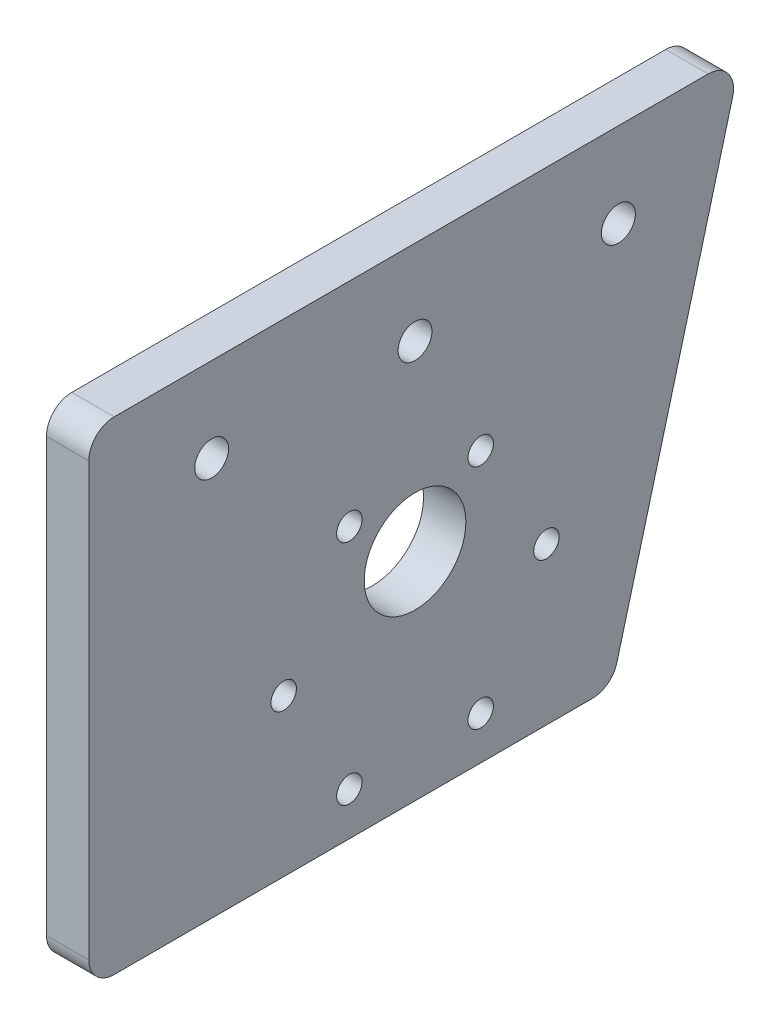
ISO-10303-21;
HEADER;
FILE_DESCRIPTION(('STEP AP214'),'2;1');
FILE_NAME('part.step','',(''),(''),'','','');
FILE_SCHEMA(('AUTOMOTIVE_DESIGN { 1 0 10303 214 1 1 1 1 }'));
ENDSEC;
DATA;
#1=APPLICATION_CONTEXT('core data for automotive mechanical design processes');
#2=APPLICATION_PROTOCOL_DEFINITION('international standard','automotive_design',2000,#1);
#3=PRODUCT_CONTEXT('',#1,'mechanical');
#4=PRODUCT('Part','Part','',(#3));
#5=PRODUCT_RELATED_PRODUCT_CATEGORY('part','',(#4));
#6=PRODUCT_DEFINITION_FORMATION('','',#4);
#7=PRODUCT_DEFINITION_CONTEXT('part definition',#1,'design');
#8=PRODUCT_DEFINITION('design','',#6,#7);
#9=PRODUCT_DEFINITION_SHAPE('','',#8);
#10=(LENGTH_UNIT() NAMED_UNIT(*) SI_UNIT(.MILLI.,.METRE.));
#11=(NAMED_UNIT(*) PLANE_ANGLE_UNIT() SI_UNIT($,.RADIAN.));
#12=(NAMED_UNIT(*) SI_UNIT($,.STERADIAN.) SOLID_ANGLE_UNIT());
#13=UNCERTAINTY_MEASURE_WITH_UNIT(LENGTH_MEASURE(1.E-05),#10,'distance_accuracy_value','');
#14=(GEOMETRIC_REPRESENTATION_CONTEXT(3) GLOBAL_UNCERTAINTY_ASSIGNED_CONTEXT((#13)) GLOBAL_UNIT_ASSIGNED_CONTEXT((#10,
#11,#12)) REPRESENTATION_CONTEXT('',''));
#15=CARTESIAN_POINT('',(0.,0.,0.));
#16=DIRECTION('',(0.,0.,1.));
#17=DIRECTION('',(1.,0.,0.));
#18=AXIS2_PLACEMENT_3D('',#15,#16,#17);
#19=CARTESIAN_POINT('',(5.,0.,0.));
#20=DIRECTION('',(-1.,0.,0.));
#21=DIRECTION('',(0.,0.,1.));
#22=AXIS2_PLACEMENT_3D('',#19,#20,#21);
#23=PLANE('',#22);
#24=DIRECTION('',(0.,0.,1.));
#25=VECTOR('',#24,1.);
#26=CARTESIAN_POINT('',(5.,0.,0.));
#27=LINE('',#26,#25);
#28=CARTESIAN_POINT('',(5.,0.,-73.0903238814764));
#29=VERTEX_POINT('',#28);
#30=CARTESIAN_POINT('',(5.,0.,-3.));
#31=VERTEX_POINT('',#30);
#32=EDGE_CURVE('E142',#29,#31,#27,.T.);
#33=ORIENTED_EDGE('',*,*,#32,.T.);
#34=CARTESIAN_POINT('',(5.,-3.,-3.));
#35=DIRECTION('',(-1.,0.,0.));
#36=DIRECTION('',(0.,0.,1.));
#37=AXIS2_PLACEMENT_3D('',#34,#35,#36);
#38=CIRCLE('',#37,3.);
#39=CARTESIAN_POINT('',(5.,-3.00000000000002,0.));
#40=VERTEX_POINT('',#39);
#41=EDGE_CURVE('E161',#31,#40,#38,.F.);
#42=ORIENTED_EDGE('',*,*,#41,.T.);
#43=DIRECTION('',(0.,-1.,0.));
#44=VECTOR('',#43,1.);
#45=CARTESIAN_POINT('',(5.,-57.,0.));
#46=LINE('',#45,#44);
#47=CARTESIAN_POINT('',(5.,-54.,0.));
#48=VERTEX_POINT('',#47);
#49=EDGE_CURVE('E125',#40,#48,#46,.T.);
#50=ORIENTED_EDGE('',*,*,#49,.T.);
#51=CARTESIAN_POINT('',(5.,-54.,-3.));
#52=DIRECTION('',(-1.,0.,0.));
#53=DIRECTION('',(0.,0.,1.));
#54=AXIS2_PLACEMENT_3D('',#51,#52,#53);
#55=CIRCLE('',#54,3.);
#56=CARTESIAN_POINT('',(5.,-57.,-3.00000000000002));
#57=VERTEX_POINT('',#56);
#58=EDGE_CURVE('E159',#48,#57,#55,.F.);
#59=ORIENTED_EDGE('',*,*,#58,.T.);
#60=DIRECTION('',(0.,0.,-1.));
#61=VECTOR('',#60,1.);
#62=CARTESIAN_POINT('',(5.,-57.,-61.7268960314258));
#63=LINE('',#62,#61);
#64=CARTESIAN_POINT('',(5.,-57.,-59.4249150674889));
#65=VERTEX_POINT('',#64);
#66=EDGE_CURVE('E172',#57,#65,#63,.T.);
#67=ORIENTED_EDGE('',*,*,#66,.T.);
#68=CARTESIAN_POINT('',(5.,-54.,-59.4249150674889));
#69=DIRECTION('',(-1.,0.,0.));
#70=DIRECTION('',(0.,0.,1.));
#71=AXIS2_PLACEMENT_3D('',#68,#69,#70);
#72=CIRCLE('',#71,3.);
#73=CARTESIAN_POINT('',(5.,-54.7764571353076,-62.3226925463561));
#74=VERTEX_POINT('',#73);
#75=EDGE_CURVE('E60',#65,#74,#72,.F.);
#76=ORIENTED_EDGE('',*,*,#75,.T.);
#77=DIRECTION('',(0.,0.965925826289067,-0.258819045102525));
#78=VECTOR('',#77,1.);
#79=CARTESIAN_POINT('',(5.,0.,-77.));
#80=LINE('',#79,#78);
#81=CARTESIAN_POINT('',(5.,-3.77645713530757,-75.9881013603436));
#82=VERTEX_POINT('',#81);
#83=EDGE_CURVE('E180',#74,#82,#80,.T.);
#84=ORIENTED_EDGE('',*,*,#83,.T.);
#85=CARTESIAN_POINT('',(5.,-3.,-73.0903238814764));
#86=DIRECTION('',(-1.,0.,0.));
#87=DIRECTION('',(0.,0.,1.));
#88=AXIS2_PLACEMENT_3D('',#85,#86,#87);
#89=CIRCLE('',#88,3.);
#90=EDGE_CURVE('E156',#82,#29,#89,.F.);
#91=ORIENTED_EDGE('',*,*,#90,.T.);
#92=EDGE_LOOP('',(#33,#42,#50,#59,#67,#76,#84,#91));
#93=FACE_BOUND('',#92,.T.);
#94=CARTESIAN_POINT('',(5.,-31.5,-38.5));
#95=DIRECTION('',(1.,0.,0.));
#96=DIRECTION('',(0.,0.,-1.));
#97=AXIS2_PLACEMENT_3D('',#94,#95,#96);
#98=CIRCLE('',#97,6.);
#99=CARTESIAN_POINT('',(5.,-31.5,-44.5));
#100=VERTEX_POINT('',#99);
#101=EDGE_CURVE('E133',#100,#100,#98,.T.);
#102=ORIENTED_EDGE('',*,*,#101,.F.);
#103=EDGE_LOOP('',(#102));
#104=FACE_BOUND('',#103,.T.);
#105=CARTESIAN_POINT('',(5.,-10.,-38.5));
#106=DIRECTION('',(1.,0.,0.));
#107=DIRECTION('',(0.,0.,-1.));
#108=AXIS2_PLACEMENT_3D('',#105,#106,#107);
#109=CIRCLE('',#108,2.);
#110=CARTESIAN_POINT('',(5.,-10.,-40.5));
#111=VERTEX_POINT('',#110);
#112=EDGE_CURVE('E187',#111,#111,#109,.T.);
#113=ORIENTED_EDGE('',*,*,#112,.F.);
#114=EDGE_LOOP('',(#113));
#115=FACE_BOUND('',#114,.T.);
#116=CARTESIAN_POINT('',(5.,-10.,-62.5));
#117=DIRECTION('',(1.,0.,0.));
#118=DIRECTION('',(0.,0.,-1.));
#119=AXIS2_PLACEMENT_3D('',#116,#117,#118);
#120=CIRCLE('',#119,2.);
#121=CARTESIAN_POINT('',(5.,-10.,-64.5));
#122=VERTEX_POINT('',#121);
#123=EDGE_CURVE('E192',#122,#122,#120,.T.);
#124=ORIENTED_EDGE('',*,*,#123,.F.);
#125=EDGE_LOOP('',(#124));
#126=FACE_BOUND('',#125,.T.);
#127=CARTESIAN_POINT('',(5.,-10.,-14.5));
#128=DIRECTION('',(1.,0.,0.));
#129=DIRECTION('',(0.,0.,-1.));
#130=AXIS2_PLACEMENT_3D('',#127,#128,#129);
#131=CIRCLE('',#130,2.);
#132=CARTESIAN_POINT('',(5.,-10.,-16.5));
#133=VERTEX_POINT('',#132);
#134=EDGE_CURVE('E198',#133,#133,#131,.T.);
#135=ORIENTED_EDGE('',*,*,#134,.F.);
#136=EDGE_LOOP('',(#135));
#137=FACE_BOUND('',#136,.T.);
#138=CARTESIAN_POINT('',(5.,-38.5,-23.));
#139=DIRECTION('',(1.,0.,0.));
#140=DIRECTION('',(0.,0.,-1.));
#141=AXIS2_PLACEMENT_3D('',#138,#139,#140);
#142=CIRCLE('',#141,1.5);
#143=CARTESIAN_POINT('',(5.,-38.5,-24.5));
#144=VERTEX_POINT('',#143);
#145=EDGE_CURVE('E204',#144,#144,#142,.T.);
#146=ORIENTED_EDGE('',*,*,#145,.F.);
#147=EDGE_LOOP('',(#146));
#148=FACE_BOUND('',#147,.T.);
#149=CARTESIAN_POINT('',(5.,-25.0766062413412,-30.75));
#150=DIRECTION('',(1.,0.,0.));
#151=DIRECTION('',(0.,0.,-1.));
#152=AXIS2_PLACEMENT_3D('',#149,#150,#151);
#153=CIRCLE('',#152,1.49999999999999);
#154=CARTESIAN_POINT('',(5.,-25.0766062413412,-32.25));
#155=VERTEX_POINT('',#154);
#156=EDGE_CURVE('E210',#155,#155,#153,.T.);
#157=ORIENTED_EDGE('',*,*,#156,.F.);
#158=EDGE_LOOP('',(#157));
#159=FACE_BOUND('',#158,.T.);
#160=CARTESIAN_POINT('',(5.,-25.0766062413412,-46.2500000000001));
#161=DIRECTION('',(1.,0.,0.));
#162=DIRECTION('',(0.,0.,-1.));
#163=AXIS2_PLACEMENT_3D('',#160,#161,#162);
#164=CIRCLE('',#163,1.5);
#165=CARTESIAN_POINT('',(5.,-25.0766062413412,-47.7500000000001));
#166=VERTEX_POINT('',#165);
#167=EDGE_CURVE('E216',#166,#166,#164,.T.);
#168=ORIENTED_EDGE('',*,*,#167,.F.);
#169=EDGE_LOOP('',(#168));
#170=FACE_BOUND('',#169,.T.);
#171=CARTESIAN_POINT('',(5.,-38.5000000000001,-54.));
#172=DIRECTION('',(1.,0.,0.));
#173=DIRECTION('',(0.,0.,-1.));
#174=AXIS2_PLACEMENT_3D('',#171,#172,#173);
#175=CIRCLE('',#174,1.49999999999999);
#176=CARTESIAN_POINT('',(5.,-38.5000000000001,-55.5));
#177=VERTEX_POINT('',#176);
#178=EDGE_CURVE('E222',#177,#177,#175,.T.);
#179=ORIENTED_EDGE('',*,*,#178,.F.);
#180=EDGE_LOOP('',(#179));
#181=FACE_BOUND('',#180,.T.);
#182=CARTESIAN_POINT('',(5.,-51.9233937586589,-46.2499999999999));
#183=DIRECTION('',(1.,0.,0.));
#184=DIRECTION('',(0.,0.,-1.));
#185=AXIS2_PLACEMENT_3D('',#182,#183,#184);
#186=CIRCLE('',#185,1.5);
#187=CARTESIAN_POINT('',(5.,-51.9233937586589,-47.7499999999999));
#188=VERTEX_POINT('',#187);
#189=EDGE_CURVE('E228',#188,#188,#186,.T.);
#190=ORIENTED_EDGE('',*,*,#189,.F.);
#191=EDGE_LOOP('',(#190));
#192=FACE_BOUND('',#191,.T.);
#193=CARTESIAN_POINT('',(5.,-51.9233937586587,-30.7499999999998));
#194=DIRECTION('',(1.,0.,0.));
#195=DIRECTION('',(0.,0.,-1.));
#196=AXIS2_PLACEMENT_3D('',#193,#194,#195);
#197=CIRCLE('',#196,1.50000000000001);
#198=CARTESIAN_POINT('',(5.,-51.9233937586587,-32.2499999999999));
#199=VERTEX_POINT('',#198);
#200=EDGE_CURVE('E234',#199,#199,#197,.T.);
#201=ORIENTED_EDGE('',*,*,#200,.F.);
#202=EDGE_LOOP('',(#201));
#203=FACE_BOUND('',#202,.T.);
#204=ADVANCED_FACE('F39',(#93,#104,#115,#126,#137,#148,#159,#170,#181,#192,#203),#23,.F.);
#205=CARTESIAN_POINT('',(0.,0.,0.));
#206=DIRECTION('',(-1.,0.,0.));
#207=DIRECTION('',(0.,0.,1.));
#208=AXIS2_PLACEMENT_3D('',#205,#206,#207);
#209=PLANE('',#208);
#210=CARTESIAN_POINT('',(0.,-51.9233937586589,-46.2499999999999));
#211=DIRECTION('',(1.,0.,0.));
#212=DIRECTION('',(0.,0.,-1.));
#213=AXIS2_PLACEMENT_3D('',#210,#211,#212);
#214=CIRCLE('',#213,1.5);
#215=CARTESIAN_POINT('',(0.,-51.9233937586589,-47.7499999999999));
#216=VERTEX_POINT('',#215);
#217=EDGE_CURVE('E231',#216,#216,#214,.T.);
#218=ORIENTED_EDGE('',*,*,#217,.T.);
#219=EDGE_LOOP('',(#218));
#220=FACE_BOUND('',#219,.T.);
#221=CARTESIAN_POINT('',(0.,-25.0766062413412,-46.2500000000001));
#222=DIRECTION('',(1.,0.,0.));
#223=DIRECTION('',(0.,0.,-1.));
#224=AXIS2_PLACEMENT_3D('',#221,#222,#223);
#225=CIRCLE('',#224,1.5);
#226=CARTESIAN_POINT('',(0.,-25.0766062413412,-47.7500000000001));
#227=VERTEX_POINT('',#226);
#228=EDGE_CURVE('E219',#227,#227,#225,.T.);
#229=ORIENTED_EDGE('',*,*,#228,.T.);
#230=EDGE_LOOP('',(#229));
#231=FACE_BOUND('',#230,.T.);
#232=CARTESIAN_POINT('',(0.,-38.5,-23.));
#233=DIRECTION('',(1.,0.,0.));
#234=DIRECTION('',(0.,0.,-1.));
#235=AXIS2_PLACEMENT_3D('',#232,#233,#234);
#236=CIRCLE('',#235,1.5);
#237=CARTESIAN_POINT('',(0.,-38.5,-24.5));
#238=VERTEX_POINT('',#237);
#239=EDGE_CURVE('E207',#238,#238,#236,.T.);
#240=ORIENTED_EDGE('',*,*,#239,.T.);
#241=EDGE_LOOP('',(#240));
#242=FACE_BOUND('',#241,.T.);
#243=CARTESIAN_POINT('',(0.,-10.,-62.5));
#244=DIRECTION('',(1.,0.,0.));
#245=DIRECTION('',(0.,0.,-1.));
#246=AXIS2_PLACEMENT_3D('',#243,#244,#245);
#247=CIRCLE('',#246,2.);
#248=CARTESIAN_POINT('',(0.,-10.,-64.5));
#249=VERTEX_POINT('',#248);
#250=EDGE_CURVE('E195',#249,#249,#247,.T.);
#251=ORIENTED_EDGE('',*,*,#250,.T.);
#252=EDGE_LOOP('',(#251));
#253=FACE_BOUND('',#252,.T.);
#254=CARTESIAN_POINT('',(0.,-31.5,-38.5));
#255=DIRECTION('',(1.,0.,0.));
#256=DIRECTION('',(0.,0.,-1.));
#257=AXIS2_PLACEMENT_3D('',#254,#255,#256);
#258=CIRCLE('',#257,6.);
#259=CARTESIAN_POINT('',(0.,-31.5,-44.5));
#260=VERTEX_POINT('',#259);
#261=EDGE_CURVE('E139',#260,#260,#258,.T.);
#262=ORIENTED_EDGE('',*,*,#261,.T.);
#263=EDGE_LOOP('',(#262));
#264=FACE_BOUND('',#263,.T.);
#265=DIRECTION('',(0.,-1.,0.));
#266=VECTOR('',#265,1.);
#267=CARTESIAN_POINT('',(0.,-57.,0.));
#268=LINE('',#267,#266);
#269=CARTESIAN_POINT('',(0.,-3.00000000000002,0.));
#270=VERTEX_POINT('',#269);
#271=CARTESIAN_POINT('',(0.,-54.,0.));
#272=VERTEX_POINT('',#271);
#273=EDGE_CURVE('E122',#270,#272,#268,.T.);
#274=ORIENTED_EDGE('',*,*,#273,.F.);
#275=CARTESIAN_POINT('',(0.,-3.,-3.));
#276=DIRECTION('',(-1.,0.,0.));
#277=DIRECTION('',(0.,0.,1.));
#278=AXIS2_PLACEMENT_3D('',#275,#276,#277);
#279=CIRCLE('',#278,3.);
#280=CARTESIAN_POINT('',(0.,0.,-3.));
#281=VERTEX_POINT('',#280);
#282=EDGE_CURVE('E105',#270,#281,#279,.T.);
#283=ORIENTED_EDGE('',*,*,#282,.T.);
#284=DIRECTION('',(0.,0.,1.));
#285=VECTOR('',#284,1.);
#286=CARTESIAN_POINT('',(0.,0.,0.));
#287=LINE('',#286,#285);
#288=CARTESIAN_POINT('',(0.,0.,-73.0903238814764));
#289=VERTEX_POINT('',#288);
#290=EDGE_CURVE('E146',#289,#281,#287,.T.);
#291=ORIENTED_EDGE('',*,*,#290,.F.);
#292=CARTESIAN_POINT('',(0.,-3.,-73.0903238814764));
#293=DIRECTION('',(-1.,0.,0.));
#294=DIRECTION('',(0.,0.,1.));
#295=AXIS2_PLACEMENT_3D('',#292,#293,#294);
#296=CIRCLE('',#295,3.);
#297=CARTESIAN_POINT('',(0.,-3.77645713530757,-75.9881013603436));
#298=VERTEX_POINT('',#297);
#299=EDGE_CURVE('E126',#289,#298,#296,.T.);
#300=ORIENTED_EDGE('',*,*,#299,.T.);
#301=DIRECTION('',(0.,0.965925826289067,-0.258819045102525));
#302=VECTOR('',#301,1.);
#303=CARTESIAN_POINT('',(0.,0.,-77.));
#304=LINE('',#303,#302);
#305=CARTESIAN_POINT('',(0.,-54.7764571353076,-62.3226925463561));
#306=VERTEX_POINT('',#305);
#307=EDGE_CURVE('E136',#306,#298,#304,.T.);
#308=ORIENTED_EDGE('',*,*,#307,.F.);
#309=CARTESIAN_POINT('',(0.,-54.,-59.4249150674889));
#310=DIRECTION('',(-1.,0.,0.));
#311=DIRECTION('',(0.,0.,1.));
#312=AXIS2_PLACEMENT_3D('',#309,#310,#311);
#313=CIRCLE('',#312,3.);
#314=CARTESIAN_POINT('',(0.,-57.,-59.4249150674889));
#315=VERTEX_POINT('',#314);
#316=EDGE_CURVE('E150',#306,#315,#313,.T.);
#317=ORIENTED_EDGE('',*,*,#316,.T.);
#318=DIRECTION('',(0.,0.,-1.));
#319=VECTOR('',#318,1.);
#320=CARTESIAN_POINT('',(0.,-57.,-61.7268960314258));
#321=LINE('',#320,#319);
#322=CARTESIAN_POINT('',(0.,-57.,-3.00000000000002));
#323=VERTEX_POINT('',#322);
#324=EDGE_CURVE('E132',#323,#315,#321,.T.);
#325=ORIENTED_EDGE('',*,*,#324,.F.);
#326=CARTESIAN_POINT('',(0.,-54.,-3.));
#327=DIRECTION('',(-1.,0.,0.));
#328=DIRECTION('',(0.,0.,1.));
#329=AXIS2_PLACEMENT_3D('',#326,#327,#328);
#330=CIRCLE('',#329,3.);
#331=EDGE_CURVE('E116',#323,#272,#330,.T.);
#332=ORIENTED_EDGE('',*,*,#331,.T.);
#333=EDGE_LOOP('',(#274,#283,#291,#300,#308,#317,#325,#332));
#334=FACE_BOUND('',#333,.T.);
#335=CARTESIAN_POINT('',(0.,-10.,-38.5));
#336=DIRECTION('',(1.,0.,0.));
#337=DIRECTION('',(0.,0.,-1.));
#338=AXIS2_PLACEMENT_3D('',#335,#336,#337);
#339=CIRCLE('',#338,2.);
#340=CARTESIAN_POINT('',(0.,-10.,-40.5));
#341=VERTEX_POINT('',#340);
#342=EDGE_CURVE('E189',#341,#341,#339,.T.);
#343=ORIENTED_EDGE('',*,*,#342,.T.);
#344=EDGE_LOOP('',(#343));
#345=FACE_BOUND('',#344,.T.);
#346=CARTESIAN_POINT('',(0.,-10.,-14.5));
#347=DIRECTION('',(1.,0.,0.));
#348=DIRECTION('',(0.,0.,-1.));
#349=AXIS2_PLACEMENT_3D('',#346,#347,#348);
#350=CIRCLE('',#349,2.);
#351=CARTESIAN_POINT('',(0.,-10.,-16.5));
#352=VERTEX_POINT('',#351);
#353=EDGE_CURVE('E201',#352,#352,#350,.T.);
#354=ORIENTED_EDGE('',*,*,#353,.T.);
#355=EDGE_LOOP('',(#354));
#356=FACE_BOUND('',#355,.T.);
#357=CARTESIAN_POINT('',(0.,-25.0766062413412,-30.75));
#358=DIRECTION('',(1.,0.,0.));
#359=DIRECTION('',(0.,0.,-1.));
#360=AXIS2_PLACEMENT_3D('',#357,#358,#359);
#361=CIRCLE('',#360,1.49999999999999);
#362=CARTESIAN_POINT('',(0.,-25.0766062413412,-32.25));
#363=VERTEX_POINT('',#362);
#364=EDGE_CURVE('E213',#363,#363,#361,.T.);
#365=ORIENTED_EDGE('',*,*,#364,.T.);
#366=EDGE_LOOP('',(#365));
#367=FACE_BOUND('',#366,.T.);
#368=CARTESIAN_POINT('',(0.,-38.5000000000001,-54.));
#369=DIRECTION('',(1.,0.,0.));
#370=DIRECTION('',(0.,0.,-1.));
#371=AXIS2_PLACEMENT_3D('',#368,#369,#370);
#372=CIRCLE('',#371,1.49999999999999);
#373=CARTESIAN_POINT('',(0.,-38.5000000000001,-55.5));
#374=VERTEX_POINT('',#373);
#375=EDGE_CURVE('E225',#374,#374,#372,.T.);
#376=ORIENTED_EDGE('',*,*,#375,.T.);
#377=EDGE_LOOP('',(#376));
#378=FACE_BOUND('',#377,.T.);
#379=CARTESIAN_POINT('',(0.,-51.9233937586587,-30.7499999999998));
#380=DIRECTION('',(1.,0.,0.));
#381=DIRECTION('',(0.,0.,-1.));
#382=AXIS2_PLACEMENT_3D('',#379,#380,#381);
#383=CIRCLE('',#382,1.50000000000001);
#384=CARTESIAN_POINT('',(0.,-51.9233937586587,-32.2499999999999));
#385=VERTEX_POINT('',#384);
#386=EDGE_CURVE('E237',#385,#385,#383,.T.);
#387=ORIENTED_EDGE('',*,*,#386,.T.);
#388=EDGE_LOOP('',(#387));
#389=FACE_BOUND('',#388,.T.);
#390=ADVANCED_FACE('F129',(#220,#231,#242,#253,#264,#334,#345,#356,#367,#378,#389),#209,.T.);
#391=CARTESIAN_POINT('',(5.,-57.,0.));
#392=DIRECTION('',(0.,0.,-1.));
#393=DIRECTION('',(-1.,0.,0.));
#394=AXIS2_PLACEMENT_3D('',#391,#392,#393);
#395=PLANE('',#394);
#396=ORIENTED_EDGE('',*,*,#49,.F.);
#397=DIRECTION('',(-1.,0.,0.));
#398=VECTOR('',#397,1.);
#399=CARTESIAN_POINT('',(5.,-3.,0.));
#400=LINE('',#399,#398);
#401=EDGE_CURVE('E109',#40,#270,#400,.T.);
#402=ORIENTED_EDGE('',*,*,#401,.T.);
#403=ORIENTED_EDGE('',*,*,#273,.T.);
#404=DIRECTION('',(-1.,0.,0.));
#405=VECTOR('',#404,1.);
#406=CARTESIAN_POINT('',(5.,-54.,0.));
#407=LINE('',#406,#405);
#408=EDGE_CURVE('E127',#272,#48,#407,.F.);
#409=ORIENTED_EDGE('',*,*,#408,.T.);
#410=EDGE_LOOP('',(#396,#402,#403,#409));
#411=FACE_BOUND('',#410,.T.);
#412=ADVANCED_FACE('F121',(#411),#395,.F.);
#413=CARTESIAN_POINT('',(5.,-57.,-61.7268960314258));
#414=DIRECTION('',(0.,1.,0.));
#415=DIRECTION('',(0.,0.,1.));
#416=AXIS2_PLACEMENT_3D('',#413,#414,#415);
#417=PLANE('',#416);
#418=ORIENTED_EDGE('',*,*,#66,.F.);
#419=DIRECTION('',(-1.,0.,0.));
#420=VECTOR('',#419,1.);
#421=CARTESIAN_POINT('',(5.,-57.,-3.));
#422=LINE('',#421,#420);
#423=EDGE_CURVE('E165',#57,#323,#422,.T.);
#424=ORIENTED_EDGE('',*,*,#423,.T.);
#425=ORIENTED_EDGE('',*,*,#324,.T.);
#426=DIRECTION('',(-1.,0.,0.));
#427=VECTOR('',#426,1.);
#428=CARTESIAN_POINT('',(5.,-57.,-59.4249150674889));
#429=LINE('',#428,#427);
#430=EDGE_CURVE('E163',#315,#65,#429,.F.);
#431=ORIENTED_EDGE('',*,*,#430,.T.);
#432=EDGE_LOOP('',(#418,#424,#425,#431));
#433=FACE_BOUND('',#432,.T.);
#434=ADVANCED_FACE('F170',(#433),#417,.F.);
#435=CARTESIAN_POINT('',(5.,0.,-77.));
#436=DIRECTION('',(0.,0.258819045102525,0.965925826289067));
#437=DIRECTION('',(0.,-0.965925826289067,0.258819045102525));
#438=AXIS2_PLACEMENT_3D('',#435,#436,#437);
#439=PLANE('',#438);
#440=ORIENTED_EDGE('',*,*,#83,.F.);
#441=DIRECTION('',(-1.,0.,0.));
#442=VECTOR('',#441,1.);
#443=CARTESIAN_POINT('',(5.,-54.7764571353076,-62.3226925463561));
#444=LINE('',#443,#442);
#445=EDGE_CURVE('E11',#74,#306,#444,.T.);
#446=ORIENTED_EDGE('',*,*,#445,.T.);
#447=ORIENTED_EDGE('',*,*,#307,.T.);
#448=DIRECTION('',(-1.,0.,0.));
#449=VECTOR('',#448,1.);
#450=CARTESIAN_POINT('',(5.,-3.77645713530757,-75.9881013603436));
#451=LINE('',#450,#449);
#452=EDGE_CURVE('E47',#298,#82,#451,.F.);
#453=ORIENTED_EDGE('',*,*,#452,.T.);
#454=EDGE_LOOP('',(#440,#446,#447,#453));
#455=FACE_BOUND('',#454,.T.);
#456=ADVANCED_FACE('F179',(#455),#439,.F.);
#457=CARTESIAN_POINT('',(5.,0.,0.));
#458=DIRECTION('',(0.,-1.,0.));
#459=DIRECTION('',(0.,0.,-1.));
#460=AXIS2_PLACEMENT_3D('',#457,#458,#459);
#461=PLANE('',#460);
#462=ORIENTED_EDGE('',*,*,#290,.T.);
#463=DIRECTION('',(-1.,0.,0.));
#464=VECTOR('',#463,1.);
#465=CARTESIAN_POINT('',(5.,0.,-3.));
#466=LINE('',#465,#464);
#467=EDGE_CURVE('E110',#281,#31,#466,.F.);
#468=ORIENTED_EDGE('',*,*,#467,.T.);
#469=ORIENTED_EDGE('',*,*,#32,.F.);
#470=DIRECTION('',(-1.,0.,0.));
#471=VECTOR('',#470,1.);
#472=CARTESIAN_POINT('',(5.,0.,-73.0903238814764));
#473=LINE('',#472,#471);
#474=EDGE_CURVE('E115',#29,#289,#473,.T.);
#475=ORIENTED_EDGE('',*,*,#474,.T.);
#476=EDGE_LOOP('',(#462,#468,#469,#475));
#477=FACE_BOUND('',#476,.T.);
#478=ADVANCED_FACE('F259',(#477),#461,.F.);
#479=CARTESIAN_POINT('',(5.,-31.5,-38.5));
#480=DIRECTION('',(-1.,0.,0.));
#481=DIRECTION('',(0.,0.,1.));
#482=AXIS2_PLACEMENT_3D('',#479,#480,#481);
#483=CYLINDRICAL_SURFACE('',#482,6.);
#484=ORIENTED_EDGE('',*,*,#101,.T.);
#485=EDGE_LOOP('',(#484));
#486=FACE_BOUND('',#485,.T.);
#487=ORIENTED_EDGE('',*,*,#261,.F.);
#488=EDGE_LOOP('',(#487));
#489=FACE_BOUND('',#488,.T.);
#490=ADVANCED_FACE('F256',(#486,#489),#483,.F.);
#491=CARTESIAN_POINT('',(5.,-10.,-38.5));
#492=DIRECTION('',(-1.,0.,0.));
#493=DIRECTION('',(0.,0.,1.));
#494=AXIS2_PLACEMENT_3D('',#491,#492,#493);
#495=CYLINDRICAL_SURFACE('',#494,2.);
#496=ORIENTED_EDGE('',*,*,#112,.T.);
#497=EDGE_LOOP('',(#496));
#498=FACE_BOUND('',#497,.T.);
#499=ORIENTED_EDGE('',*,*,#342,.F.);
#500=EDGE_LOOP('',(#499));
#501=FACE_BOUND('',#500,.T.);
#502=ADVANCED_FACE('F376',(#498,#501),#495,.F.);
#503=CARTESIAN_POINT('',(5.,-10.,-62.5));
#504=DIRECTION('',(-1.,0.,0.));
#505=DIRECTION('',(0.,0.,1.));
#506=AXIS2_PLACEMENT_3D('',#503,#504,#505);
#507=CYLINDRICAL_SURFACE('',#506,2.);
#508=ORIENTED_EDGE('',*,*,#123,.T.);
#509=EDGE_LOOP('',(#508));
#510=FACE_BOUND('',#509,.T.);
#511=ORIENTED_EDGE('',*,*,#250,.F.);
#512=EDGE_LOOP('',(#511));
#513=FACE_BOUND('',#512,.T.);
#514=ADVANCED_FACE('F366',(#510,#513),#507,.F.);
#515=CARTESIAN_POINT('',(5.,-10.,-14.5));
#516=DIRECTION('',(-1.,0.,0.));
#517=DIRECTION('',(0.,0.,1.));
#518=AXIS2_PLACEMENT_3D('',#515,#516,#517);
#519=CYLINDRICAL_SURFACE('',#518,2.);
#520=ORIENTED_EDGE('',*,*,#134,.T.);
#521=EDGE_LOOP('',(#520));
#522=FACE_BOUND('',#521,.T.);
#523=ORIENTED_EDGE('',*,*,#353,.F.);
#524=EDGE_LOOP('',(#523));
#525=FACE_BOUND('',#524,.T.);
#526=ADVANCED_FACE('F356',(#522,#525),#519,.F.);
#527=CARTESIAN_POINT('',(5.,-38.5,-23.));
#528=DIRECTION('',(-1.,0.,0.));
#529=DIRECTION('',(0.,0.,1.));
#530=AXIS2_PLACEMENT_3D('',#527,#528,#529);
#531=CYLINDRICAL_SURFACE('',#530,1.5);
#532=ORIENTED_EDGE('',*,*,#145,.T.);
#533=EDGE_LOOP('',(#532));
#534=FACE_BOUND('',#533,.T.);
#535=ORIENTED_EDGE('',*,*,#239,.F.);
#536=EDGE_LOOP('',(#535));
#537=FACE_BOUND('',#536,.T.);
#538=ADVANCED_FACE('F346',(#534,#537),#531,.F.);
#539=CARTESIAN_POINT('',(5.,-25.0766062413412,-30.75));
#540=DIRECTION('',(-1.,0.,0.));
#541=DIRECTION('',(0.,0.,1.));
#542=AXIS2_PLACEMENT_3D('',#539,#540,#541);
#543=CYLINDRICAL_SURFACE('',#542,1.49999999999999);
#544=ORIENTED_EDGE('',*,*,#156,.T.);
#545=EDGE_LOOP('',(#544));
#546=FACE_BOUND('',#545,.T.);
#547=ORIENTED_EDGE('',*,*,#364,.F.);
#548=EDGE_LOOP('',(#547));
#549=FACE_BOUND('',#548,.T.);
#550=ADVANCED_FACE('F336',(#546,#549),#543,.F.);
#551=CARTESIAN_POINT('',(5.,-25.0766062413412,-46.2500000000001));
#552=DIRECTION('',(-1.,0.,0.));
#553=DIRECTION('',(0.,0.,1.));
#554=AXIS2_PLACEMENT_3D('',#551,#552,#553);
#555=CYLINDRICAL_SURFACE('',#554,1.5);
#556=ORIENTED_EDGE('',*,*,#167,.T.);
#557=EDGE_LOOP('',(#556));
#558=FACE_BOUND('',#557,.T.);
#559=ORIENTED_EDGE('',*,*,#228,.F.);
#560=EDGE_LOOP('',(#559));
#561=FACE_BOUND('',#560,.T.);
#562=ADVANCED_FACE('F326',(#558,#561),#555,.F.);
#563=CARTESIAN_POINT('',(5.,-38.5000000000001,-54.));
#564=DIRECTION('',(-1.,0.,0.));
#565=DIRECTION('',(0.,0.,1.));
#566=AXIS2_PLACEMENT_3D('',#563,#564,#565);
#567=CYLINDRICAL_SURFACE('',#566,1.49999999999999);
#568=ORIENTED_EDGE('',*,*,#178,.T.);
#569=EDGE_LOOP('',(#568));
#570=FACE_BOUND('',#569,.T.);
#571=ORIENTED_EDGE('',*,*,#375,.F.);
#572=EDGE_LOOP('',(#571));
#573=FACE_BOUND('',#572,.T.);
#574=ADVANCED_FACE('F316',(#570,#573),#567,.F.);
#575=CARTESIAN_POINT('',(5.,-51.9233937586589,-46.2499999999999));
#576=DIRECTION('',(-1.,0.,0.));
#577=DIRECTION('',(0.,0.,1.));
#578=AXIS2_PLACEMENT_3D('',#575,#576,#577);
#579=CYLINDRICAL_SURFACE('',#578,1.5);
#580=ORIENTED_EDGE('',*,*,#189,.T.);
#581=EDGE_LOOP('',(#580));
#582=FACE_BOUND('',#581,.T.);
#583=ORIENTED_EDGE('',*,*,#217,.F.);
#584=EDGE_LOOP('',(#583));
#585=FACE_BOUND('',#584,.T.);
#586=ADVANCED_FACE('F307',(#582,#585),#579,.F.);
#587=CARTESIAN_POINT('',(5.,-51.9233937586587,-30.7499999999998));
#588=DIRECTION('',(-1.,0.,0.));
#589=DIRECTION('',(0.,0.,1.));
#590=AXIS2_PLACEMENT_3D('',#587,#588,#589);
#591=CYLINDRICAL_SURFACE('',#590,1.50000000000001);
#592=ORIENTED_EDGE('',*,*,#200,.T.);
#593=EDGE_LOOP('',(#592));
#594=FACE_BOUND('',#593,.T.);
#595=ORIENTED_EDGE('',*,*,#386,.F.);
#596=EDGE_LOOP('',(#595));
#597=FACE_BOUND('',#596,.T.);
#598=ADVANCED_FACE('F243',(#594,#597),#591,.F.);
#599=CARTESIAN_POINT('',(5.,-3.,-3.));
#600=DIRECTION('',(-1.,0.,0.));
#601=DIRECTION('',(0.,0.,1.));
#602=AXIS2_PLACEMENT_3D('',#599,#600,#601);
#603=CYLINDRICAL_SURFACE('',#602,3.);
#604=ORIENTED_EDGE('',*,*,#41,.F.);
#605=ORIENTED_EDGE('',*,*,#467,.F.);
#606=ORIENTED_EDGE('',*,*,#282,.F.);
#607=ORIENTED_EDGE('',*,*,#401,.F.);
#608=EDGE_LOOP('',(#604,#605,#606,#607));
#609=FACE_BOUND('',#608,.T.);
#610=ADVANCED_FACE('F108',(#609),#603,.T.);
#611=CARTESIAN_POINT('',(5.,-54.,-3.));
#612=DIRECTION('',(-1.,0.,0.));
#613=DIRECTION('',(0.,0.,1.));
#614=AXIS2_PLACEMENT_3D('',#611,#612,#613);
#615=CYLINDRICAL_SURFACE('',#614,3.);
#616=ORIENTED_EDGE('',*,*,#58,.F.);
#617=ORIENTED_EDGE('',*,*,#408,.F.);
#618=ORIENTED_EDGE('',*,*,#331,.F.);
#619=ORIENTED_EDGE('',*,*,#423,.F.);
#620=EDGE_LOOP('',(#616,#617,#618,#619));
#621=FACE_BOUND('',#620,.T.);
#622=ADVANCED_FACE('F271',(#621),#615,.T.);
#623=CARTESIAN_POINT('',(5.,-54.,-59.4249150674889));
#624=DIRECTION('',(-1.,0.,0.));
#625=DIRECTION('',(0.,0.,1.));
#626=AXIS2_PLACEMENT_3D('',#623,#624,#625);
#627=CYLINDRICAL_SURFACE('',#626,3.);
#628=ORIENTED_EDGE('',*,*,#75,.F.);
#629=ORIENTED_EDGE('',*,*,#430,.F.);
#630=ORIENTED_EDGE('',*,*,#316,.F.);
#631=ORIENTED_EDGE('',*,*,#445,.F.);
#632=EDGE_LOOP('',(#628,#629,#630,#631));
#633=FACE_BOUND('',#632,.T.);
#634=ADVANCED_FACE('F178',(#633),#627,.T.);
#635=CARTESIAN_POINT('',(5.,-3.,-73.0903238814764));
#636=DIRECTION('',(-1.,0.,0.));
#637=DIRECTION('',(0.,0.,1.));
#638=AXIS2_PLACEMENT_3D('',#635,#636,#637);
#639=CYLINDRICAL_SURFACE('',#638,3.);
#640=ORIENTED_EDGE('',*,*,#90,.F.);
#641=ORIENTED_EDGE('',*,*,#452,.F.);
#642=ORIENTED_EDGE('',*,*,#299,.F.);
#643=ORIENTED_EDGE('',*,*,#474,.F.);
#644=EDGE_LOOP('',(#640,#641,#642,#643));
#645=FACE_BOUND('',#644,.T.);
#646=ADVANCED_FACE('F41',(#645),#639,.T.);
#647=CLOSED_SHELL('',(#204,#390,#412,#434,#456,#478,#490,#502,#514,#526,#538,#550,#562,#574,
#586,#598,#610,#622,#634,#646));
#648=MANIFOLD_SOLID_BREP('B2',#647);
#649=ADVANCED_BREP_SHAPE_REPRESENTATION('',(#18,#648),#14);
#650=SHAPE_DEFINITION_REPRESENTATION(#9,#649);
ENDSEC;
END-ISO-10303-21;
